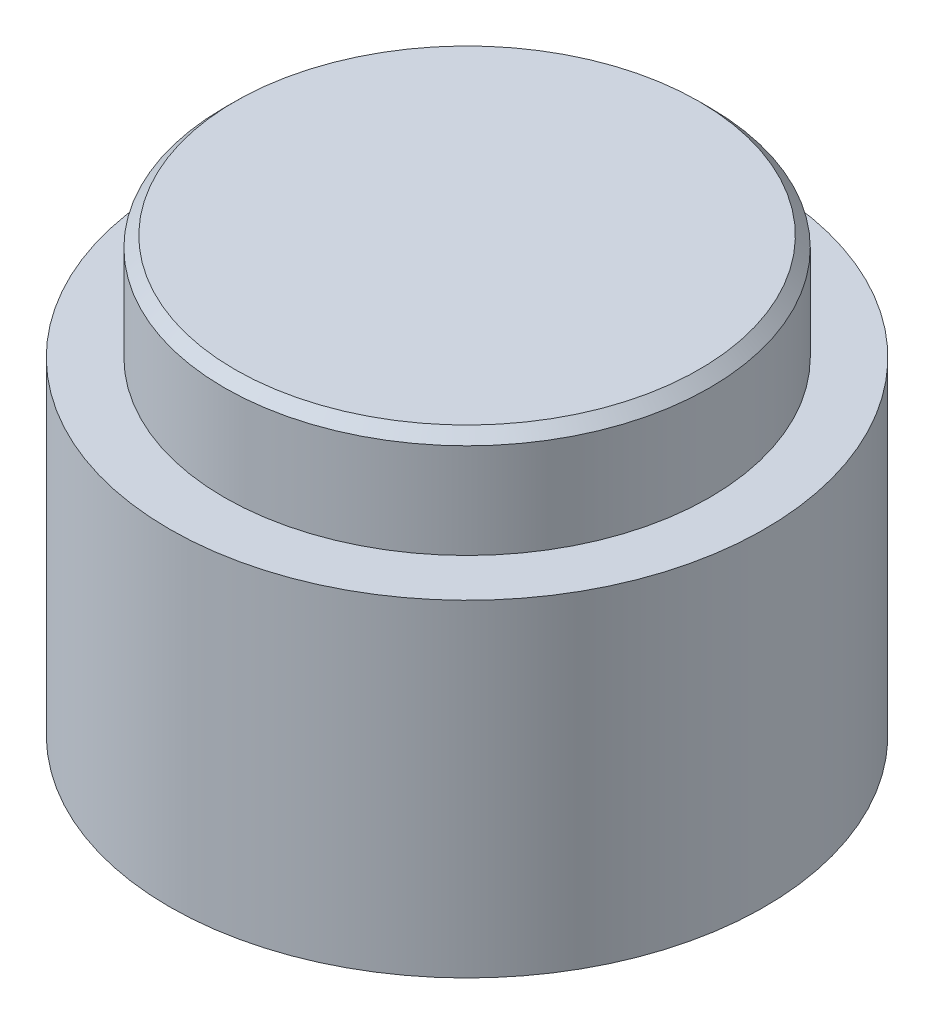
ISO-10303-21;
HEADER;
FILE_DESCRIPTION(('STEP AP214'),'2;1');
FILE_NAME('part.step','',(''),(''),'','','');
FILE_SCHEMA(('AUTOMOTIVE_DESIGN { 1 0 10303 214 1 1 1 1 }'));
ENDSEC;
DATA;
#1=APPLICATION_CONTEXT('core data for automotive mechanical design processes');
#2=APPLICATION_PROTOCOL_DEFINITION('international standard','automotive_design',2000,#1);
#3=PRODUCT_CONTEXT('',#1,'mechanical');
#4=PRODUCT('Part','Part','',(#3));
#5=PRODUCT_RELATED_PRODUCT_CATEGORY('part','',(#4));
#6=PRODUCT_DEFINITION_FORMATION('','',#4);
#7=PRODUCT_DEFINITION_CONTEXT('part definition',#1,'design');
#8=PRODUCT_DEFINITION('design','',#6,#7);
#9=PRODUCT_DEFINITION_SHAPE('','',#8);
#10=(LENGTH_UNIT() NAMED_UNIT(*) SI_UNIT(.MILLI.,.METRE.));
#11=(NAMED_UNIT(*) PLANE_ANGLE_UNIT() SI_UNIT($,.RADIAN.));
#12=(NAMED_UNIT(*) SI_UNIT($,.STERADIAN.) SOLID_ANGLE_UNIT());
#13=UNCERTAINTY_MEASURE_WITH_UNIT(LENGTH_MEASURE(1.E-05),#10,'distance_accuracy_value','');
#14=(GEOMETRIC_REPRESENTATION_CONTEXT(3) GLOBAL_UNCERTAINTY_ASSIGNED_CONTEXT((#13)) GLOBAL_UNIT_ASSIGNED_CONTEXT((#10,
#11,#12)) REPRESENTATION_CONTEXT('',''));
#15=CARTESIAN_POINT('',(0.,0.,0.));
#16=DIRECTION('',(0.,0.,1.));
#17=DIRECTION('',(1.,0.,0.));
#18=AXIS2_PLACEMENT_3D('',#15,#16,#17);
#19=CARTESIAN_POINT('',(0.,15.5,0.));
#20=DIRECTION('',(0.,1.,0.));
#21=DIRECTION('',(0.,0.,1.));
#22=AXIS2_PLACEMENT_3D('',#19,#20,#21);
#23=PLANE('',#22);
#24=CARTESIAN_POINT('',(0.,15.5,0.));
#25=DIRECTION('',(0.,1.,0.));
#26=DIRECTION('',(0.,0.,1.));
#27=AXIS2_PLACEMENT_3D('',#24,#25,#26);
#28=CIRCLE('',#27,14.1);
#29=CARTESIAN_POINT('',(0.,15.5,14.1));
#30=VERTEX_POINT('',#29);
#31=EDGE_CURVE('E40',#30,#30,#28,.T.);
#32=ORIENTED_EDGE('',*,*,#31,.T.);
#33=EDGE_LOOP('',(#32));
#34=FACE_BOUND('',#33,.T.);
#35=CARTESIAN_POINT('',(0.,15.5,0.));
#36=DIRECTION('',(0.,1.,0.));
#37=DIRECTION('',(0.,0.,1.));
#38=AXIS2_PLACEMENT_3D('',#35,#36,#37);
#39=CIRCLE('',#38,11.5);
#40=CARTESIAN_POINT('',(0.,15.5,11.5));
#41=VERTEX_POINT('',#40);
#42=EDGE_CURVE('E48',#41,#41,#39,.T.);
#43=ORIENTED_EDGE('',*,*,#42,.F.);
#44=EDGE_LOOP('',(#43));
#45=FACE_BOUND('',#44,.T.);
#46=ADVANCED_FACE('F29',(#34,#45),#23,.T.);
#47=CARTESIAN_POINT('',(0.,15.5,0.));
#48=DIRECTION('',(0.,-1.,0.));
#49=DIRECTION('',(0.,0.,-1.));
#50=AXIS2_PLACEMENT_3D('',#47,#48,#49);
#51=CYLINDRICAL_SURFACE('',#50,14.1);
#52=ORIENTED_EDGE('',*,*,#31,.F.);
#53=EDGE_LOOP('',(#52));
#54=FACE_BOUND('',#53,.T.);
#55=CARTESIAN_POINT('',(0.,0.,0.));
#56=DIRECTION('',(0.,1.,0.));
#57=DIRECTION('',(0.,0.,1.));
#58=AXIS2_PLACEMENT_3D('',#55,#56,#57);
#59=CIRCLE('',#58,14.1);
#60=CARTESIAN_POINT('',(0.,0.,14.1));
#61=VERTEX_POINT('',#60);
#62=EDGE_CURVE('E44',#61,#61,#59,.T.);
#63=ORIENTED_EDGE('',*,*,#62,.T.);
#64=EDGE_LOOP('',(#63));
#65=FACE_BOUND('',#64,.T.);
#66=ADVANCED_FACE('F71',(#54,#65),#51,.T.);
#67=CARTESIAN_POINT('',(0.,0.,0.));
#68=DIRECTION('',(0.,1.,0.));
#69=DIRECTION('',(0.,0.,1.));
#70=AXIS2_PLACEMENT_3D('',#67,#68,#69);
#71=PLANE('',#70);
#72=CARTESIAN_POINT('',(0.,0.,0.));
#73=DIRECTION('',(0.,-1.,0.));
#74=DIRECTION('',(0.,0.,-1.));
#75=AXIS2_PLACEMENT_3D('',#72,#73,#74);
#76=CIRCLE('',#75,11.6179583361763);
#77=CARTESIAN_POINT('',(0.,0.,-11.6179583361763));
#78=VERTEX_POINT('',#77);
#79=EDGE_CURVE('E53',#78,#78,#76,.T.);
#80=ORIENTED_EDGE('',*,*,#79,.F.);
#81=EDGE_LOOP('',(#80));
#82=FACE_BOUND('',#81,.T.);
#83=ORIENTED_EDGE('',*,*,#62,.F.);
#84=EDGE_LOOP('',(#83));
#85=FACE_BOUND('',#84,.T.);
#86=ADVANCED_FACE('F67',(#82,#85),#71,.F.);
#87=CARTESIAN_POINT('',(0.,20.5,0.));
#88=DIRECTION('',(0.,-1.,0.));
#89=DIRECTION('',(0.,0.,-1.));
#90=AXIS2_PLACEMENT_3D('',#87,#88,#89);
#91=CYLINDRICAL_SURFACE('',#90,11.5);
#92=CARTESIAN_POINT('',(0.,20.,0.));
#93=DIRECTION('',(0.,1.,0.));
#94=DIRECTION('',(0.,0.,1.));
#95=AXIS2_PLACEMENT_3D('',#92,#93,#94);
#96=CIRCLE('',#95,11.5);
#97=CARTESIAN_POINT('',(0.,20.,11.5));
#98=VERTEX_POINT('',#97);
#99=EDGE_CURVE('E10',#98,#98,#96,.F.);
#100=ORIENTED_EDGE('',*,*,#99,.T.);
#101=EDGE_LOOP('',(#100));
#102=FACE_BOUND('',#101,.T.);
#103=ORIENTED_EDGE('',*,*,#42,.T.);
#104=EDGE_LOOP('',(#103));
#105=FACE_BOUND('',#104,.T.);
#106=ADVANCED_FACE('F70',(#102,#105),#91,.T.);
#107=CARTESIAN_POINT('',(0.,20.5,0.));
#108=DIRECTION('',(0.,1.,0.));
#109=DIRECTION('',(0.,0.,1.));
#110=AXIS2_PLACEMENT_3D('',#107,#108,#109);
#111=PLANE('',#110);
#112=CARTESIAN_POINT('',(0.,20.5,0.));
#113=DIRECTION('',(0.,1.,0.));
#114=DIRECTION('',(0.,0.,1.));
#115=AXIS2_PLACEMENT_3D('',#112,#113,#114);
#116=CIRCLE('',#115,11.);
#117=CARTESIAN_POINT('',(0.,20.5,11.));
#118=VERTEX_POINT('',#117);
#119=EDGE_CURVE('E36',#118,#118,#116,.T.);
#120=ORIENTED_EDGE('',*,*,#119,.T.);
#121=EDGE_LOOP('',(#120));
#122=FACE_BOUND('',#121,.T.);
#123=ADVANCED_FACE('F86',(#122),#111,.T.);
#124=CARTESIAN_POINT('',(0.,20.5,0.));
#125=DIRECTION('',(0.,-1.,0.));
#126=DIRECTION('',(0.,0.,-1.));
#127=AXIS2_PLACEMENT_3D('',#124,#125,#126);
#128=CONICAL_SURFACE('',#127,11.,0.785398163397448);
#129=ORIENTED_EDGE('',*,*,#99,.F.);
#130=EDGE_LOOP('',(#129));
#131=FACE_BOUND('',#130,.T.);
#132=ORIENTED_EDGE('',*,*,#119,.F.);
#133=EDGE_LOOP('',(#132));
#134=FACE_BOUND('',#133,.T.);
#135=ADVANCED_FACE('F31',(#131,#134),#128,.T.);
#136=CARTESIAN_POINT('',(0.,3.,0.));
#137=DIRECTION('',(0.,-1.,0.));
#138=DIRECTION('',(0.,0.,-1.));
#139=AXIS2_PLACEMENT_3D('',#136,#137,#138);
#140=CYLINDRICAL_SURFACE('',#139,11.6179583361763);
#141=CARTESIAN_POINT('',(0.,3.,0.));
#142=DIRECTION('',(0.,-1.,0.));
#143=DIRECTION('',(0.,0.,-1.));
#144=AXIS2_PLACEMENT_3D('',#141,#142,#143);
#145=CIRCLE('',#144,11.6179583361763);
#146=CARTESIAN_POINT('',(0.,3.,-11.6179583361763));
#147=VERTEX_POINT('',#146);
#148=EDGE_CURVE('E52',#147,#147,#145,.T.);
#149=ORIENTED_EDGE('',*,*,#148,.F.);
#150=EDGE_LOOP('',(#149));
#151=FACE_BOUND('',#150,.T.);
#152=ORIENTED_EDGE('',*,*,#79,.T.);
#153=EDGE_LOOP('',(#152));
#154=FACE_BOUND('',#153,.T.);
#155=ADVANCED_FACE('F61',(#151,#154),#140,.F.);
#156=CARTESIAN_POINT('',(0.,3.,0.));
#157=DIRECTION('',(0.,-1.,0.));
#158=DIRECTION('',(0.,0.,-1.));
#159=AXIS2_PLACEMENT_3D('',#156,#157,#158);
#160=PLANE('',#159);
#161=ORIENTED_EDGE('',*,*,#148,.T.);
#162=EDGE_LOOP('',(#161));
#163=FACE_BOUND('',#162,.T.);
#164=ADVANCED_FACE('F59',(#163),#160,.T.);
#165=CLOSED_SHELL('',(#46,#66,#86,#106,#123,#135,#155,#164));
#166=MANIFOLD_SOLID_BREP('B2',#165);
#167=ADVANCED_BREP_SHAPE_REPRESENTATION('',(#18,#166),#14);
#168=SHAPE_DEFINITION_REPRESENTATION(#9,#167);
ENDSEC;
END-ISO-10303-21;
